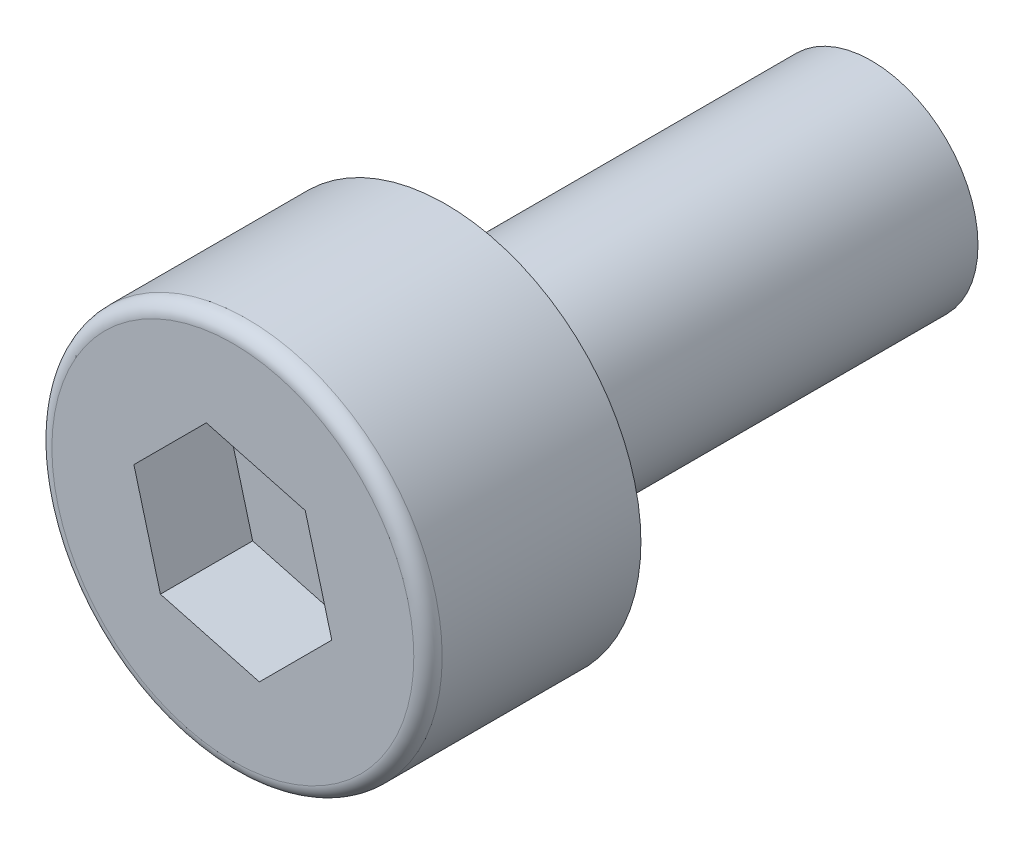
ISO-10303-21;
HEADER;
FILE_DESCRIPTION(('STEP AP214'),'2;1');
FILE_NAME('part.step','',(''),(''),'','','');
FILE_SCHEMA(('AUTOMOTIVE_DESIGN { 1 0 10303 214 1 1 1 1 }'));
ENDSEC;
DATA;
#1=APPLICATION_CONTEXT('core data for automotive mechanical design processes');
#2=APPLICATION_PROTOCOL_DEFINITION('international standard','automotive_design',2000,#1);
#3=PRODUCT_CONTEXT('',#1,'mechanical');
#4=PRODUCT('Part','Part','',(#3));
#5=PRODUCT_RELATED_PRODUCT_CATEGORY('part','',(#4));
#6=PRODUCT_DEFINITION_FORMATION('','',#4);
#7=PRODUCT_DEFINITION_CONTEXT('part definition',#1,'design');
#8=PRODUCT_DEFINITION('design','',#6,#7);
#9=PRODUCT_DEFINITION_SHAPE('','',#8);
#10=(LENGTH_UNIT() NAMED_UNIT(*) SI_UNIT(.MILLI.,.METRE.));
#11=(NAMED_UNIT(*) PLANE_ANGLE_UNIT() SI_UNIT($,.RADIAN.));
#12=(NAMED_UNIT(*) SI_UNIT($,.STERADIAN.) SOLID_ANGLE_UNIT());
#13=UNCERTAINTY_MEASURE_WITH_UNIT(LENGTH_MEASURE(1.E-05),#10,'distance_accuracy_value','');
#14=(GEOMETRIC_REPRESENTATION_CONTEXT(3) GLOBAL_UNCERTAINTY_ASSIGNED_CONTEXT((#13)) GLOBAL_UNIT_ASSIGNED_CONTEXT((#10,
#11,#12)) REPRESENTATION_CONTEXT('',''));
#15=CARTESIAN_POINT('',(0.,0.,0.));
#16=DIRECTION('',(0.,0.,1.));
#17=DIRECTION('',(1.,0.,0.));
#18=AXIS2_PLACEMENT_3D('',#15,#16,#17);
#19=CARTESIAN_POINT('',(0.,0.,0.));
#20=DIRECTION('',(0.,0.,1.));
#21=DIRECTION('',(1.,0.,0.));
#22=AXIS2_PLACEMENT_3D('',#19,#20,#21);
#23=PLANE('',#22);
#24=CARTESIAN_POINT('',(0.,0.,0.));
#25=DIRECTION('',(0.,0.,1.));
#26=DIRECTION('',(1.,0.,0.));
#27=AXIS2_PLACEMENT_3D('',#24,#25,#26);
#28=CIRCLE('',#27,2.75);
#29=CARTESIAN_POINT('',(2.75,0.,0.));
#30=VERTEX_POINT('',#29);
#31=EDGE_CURVE('E137',#30,#30,#28,.T.);
#32=ORIENTED_EDGE('',*,*,#31,.F.);
#33=EDGE_LOOP('',(#32));
#34=FACE_BOUND('',#33,.T.);
#35=CARTESIAN_POINT('',(0.,0.,0.));
#36=DIRECTION('',(0.,0.,1.));
#37=DIRECTION('',(1.,0.,0.));
#38=AXIS2_PLACEMENT_3D('',#35,#36,#37);
#39=CIRCLE('',#38,1.5);
#40=CARTESIAN_POINT('',(1.5,0.,0.));
#41=VERTEX_POINT('',#40);
#42=EDGE_CURVE('E145',#41,#41,#39,.F.);
#43=ORIENTED_EDGE('',*,*,#42,.F.);
#44=EDGE_LOOP('',(#43));
#45=FACE_BOUND('',#44,.T.);
#46=ADVANCED_FACE('F34',(#34,#45),#23,.F.);
#47=CARTESIAN_POINT('',(0.,0.,3.));
#48=DIRECTION('',(0.,0.,-1.));
#49=DIRECTION('',(-1.,0.,0.));
#50=AXIS2_PLACEMENT_3D('',#47,#48,#49);
#51=CYLINDRICAL_SURFACE('',#50,2.75);
#52=CARTESIAN_POINT('',(0.,0.,2.8));
#53=DIRECTION('',(0.,0.,1.));
#54=DIRECTION('',(1.,0.,0.));
#55=AXIS2_PLACEMENT_3D('',#52,#53,#54);
#56=CIRCLE('',#55,2.75);
#57=CARTESIAN_POINT('',(2.75,0.,2.8));
#58=VERTEX_POINT('',#57);
#59=EDGE_CURVE('E11',#58,#58,#56,.F.);
#60=ORIENTED_EDGE('',*,*,#59,.T.);
#61=EDGE_LOOP('',(#60));
#62=FACE_BOUND('',#61,.T.);
#63=ORIENTED_EDGE('',*,*,#31,.T.);
#64=EDGE_LOOP('',(#63));
#65=FACE_BOUND('',#64,.T.);
#66=ADVANCED_FACE('F164',(#62,#65),#51,.T.);
#67=CARTESIAN_POINT('',(0.,0.,3.));
#68=DIRECTION('',(0.,0.,1.));
#69=DIRECTION('',(1.,0.,0.));
#70=AXIS2_PLACEMENT_3D('',#67,#68,#69);
#71=PLANE('',#70);
#72=CARTESIAN_POINT('',(0.,0.,3.));
#73=DIRECTION('',(0.,0.,1.));
#74=DIRECTION('',(1.,0.,0.));
#75=AXIS2_PLACEMENT_3D('',#72,#73,#74);
#76=CIRCLE('',#75,2.55);
#77=CARTESIAN_POINT('',(2.55,0.,3.));
#78=VERTEX_POINT('',#77);
#79=EDGE_CURVE('E42',#78,#78,#76,.T.);
#80=ORIENTED_EDGE('',*,*,#79,.T.);
#81=EDGE_LOOP('',(#80));
#82=FACE_BOUND('',#81,.T.);
#83=DIRECTION('',(0.258819045102521,-0.965925826289068,0.));
#84=VECTOR('',#83,1.);
#85=CARTESIAN_POINT('',(-1.39419383956301,0.373573113403356,3.));
#86=LINE('',#85,#84);
#87=CARTESIAN_POINT('',(-1.39419383956301,0.373573113403356,3.));
#88=VERTEX_POINT('',#87);
#89=CARTESIAN_POINT('',(-1.02062072615966,-1.02062072615966,3.));
#90=VERTEX_POINT('',#89);
#91=EDGE_CURVE('E49',#88,#90,#86,.T.);
#92=ORIENTED_EDGE('',*,*,#91,.F.);
#93=DIRECTION('',(-0.707106781186548,-0.707106781186548,0.));
#94=VECTOR('',#93,1.);
#95=CARTESIAN_POINT('',(-0.373573113403355,1.39419383956301,3.));
#96=LINE('',#95,#94);
#97=CARTESIAN_POINT('',(-0.373573113403355,1.39419383956301,3.));
#98=VERTEX_POINT('',#97);
#99=EDGE_CURVE('E133',#98,#88,#96,.T.);
#100=ORIENTED_EDGE('',*,*,#99,.F.);
#101=DIRECTION('',(-0.965925826289068,0.258819045102521,0.));
#102=VECTOR('',#101,1.);
#103=CARTESIAN_POINT('',(1.02062072615966,1.02062072615966,3.));
#104=LINE('',#103,#102);
#105=CARTESIAN_POINT('',(1.02062072615966,1.02062072615966,3.));
#106=VERTEX_POINT('',#105);
#107=EDGE_CURVE('E131',#106,#98,#104,.T.);
#108=ORIENTED_EDGE('',*,*,#107,.F.);
#109=DIRECTION('',(-0.258819045102521,0.965925826289068,0.));
#110=VECTOR('',#109,1.);
#111=CARTESIAN_POINT('',(1.39419383956301,-0.373573113403355,3.));
#112=LINE('',#111,#110);
#113=CARTESIAN_POINT('',(1.39419383956301,-0.373573113403355,3.));
#114=VERTEX_POINT('',#113);
#115=EDGE_CURVE('E97',#114,#106,#112,.T.);
#116=ORIENTED_EDGE('',*,*,#115,.F.);
#117=DIRECTION('',(0.707106781186548,0.707106781186548,0.));
#118=VECTOR('',#117,1.);
#119=CARTESIAN_POINT('',(0.373573113403355,-1.39419383956301,3.));
#120=LINE('',#119,#118);
#121=CARTESIAN_POINT('',(0.373573113403355,-1.39419383956301,3.));
#122=VERTEX_POINT('',#121);
#123=EDGE_CURVE('E127',#122,#114,#120,.T.);
#124=ORIENTED_EDGE('',*,*,#123,.F.);
#125=DIRECTION('',(0.965925826289068,-0.258819045102521,0.));
#126=VECTOR('',#125,1.);
#127=CARTESIAN_POINT('',(-1.02062072615966,-1.02062072615966,3.));
#128=LINE('',#127,#126);
#129=EDGE_CURVE('E123',#90,#122,#128,.T.);
#130=ORIENTED_EDGE('',*,*,#129,.F.);
#131=EDGE_LOOP('',(#92,#100,#108,#116,#124,#130));
#132=FACE_BOUND('',#131,.T.);
#133=ADVANCED_FACE('F150',(#82,#132),#71,.T.);
#134=CARTESIAN_POINT('',(-1.39419383956301,0.373573113403356,1.7));
#135=DIRECTION('',(-0.965925826289068,-0.258819045102521,0.));
#136=DIRECTION('',(0.258819045102521,-0.965925826289068,0.));
#137=AXIS2_PLACEMENT_3D('',#134,#135,#136);
#138=PLANE('',#137);
#139=ORIENTED_EDGE('',*,*,#91,.T.);
#140=DIRECTION('',(0.,0.,1.));
#141=VECTOR('',#140,1.);
#142=CARTESIAN_POINT('',(-1.02062072615966,-1.02062072615966,1.7));
#143=LINE('',#142,#141);
#144=CARTESIAN_POINT('',(-1.02062072615966,-1.02062072615966,1.7));
#145=VERTEX_POINT('',#144);
#146=EDGE_CURVE('E79',#145,#90,#143,.T.);
#147=ORIENTED_EDGE('',*,*,#146,.F.);
#148=DIRECTION('',(0.258819045102521,-0.965925826289068,0.));
#149=VECTOR('',#148,1.);
#150=CARTESIAN_POINT('',(-1.39419383956301,0.373573113403356,1.7));
#151=LINE('',#150,#149);
#152=CARTESIAN_POINT('',(-1.39419383956301,0.373573113403356,1.7));
#153=VERTEX_POINT('',#152);
#154=EDGE_CURVE('E135',#153,#145,#151,.T.);
#155=ORIENTED_EDGE('',*,*,#154,.F.);
#156=DIRECTION('',(0.,0.,1.));
#157=VECTOR('',#156,1.);
#158=CARTESIAN_POINT('',(-1.39419383956301,0.373573113403356,1.7));
#159=LINE('',#158,#157);
#160=EDGE_CURVE('E57',#153,#88,#159,.T.);
#161=ORIENTED_EDGE('',*,*,#160,.T.);
#162=EDGE_LOOP('',(#139,#147,#155,#161));
#163=FACE_BOUND('',#162,.T.);
#164=ADVANCED_FACE('F176',(#163),#138,.F.);
#165=CARTESIAN_POINT('',(-0.373573113403355,1.39419383956301,1.7));
#166=DIRECTION('',(-0.707106781186548,0.707106781186548,0.));
#167=DIRECTION('',(-0.707106781186548,-0.707106781186548,0.));
#168=AXIS2_PLACEMENT_3D('',#165,#166,#167);
#169=PLANE('',#168);
#170=ORIENTED_EDGE('',*,*,#99,.T.);
#171=ORIENTED_EDGE('',*,*,#160,.F.);
#172=DIRECTION('',(-0.707106781186548,-0.707106781186548,0.));
#173=VECTOR('',#172,1.);
#174=CARTESIAN_POINT('',(-0.373573113403355,1.39419383956301,1.7));
#175=LINE('',#174,#173);
#176=CARTESIAN_POINT('',(-0.373573113403355,1.39419383956301,1.7));
#177=VERTEX_POINT('',#176);
#178=EDGE_CURVE('E109',#177,#153,#175,.T.);
#179=ORIENTED_EDGE('',*,*,#178,.F.);
#180=DIRECTION('',(0.,0.,1.));
#181=VECTOR('',#180,1.);
#182=CARTESIAN_POINT('',(-0.373573113403355,1.39419383956301,1.7));
#183=LINE('',#182,#181);
#184=EDGE_CURVE('E101',#177,#98,#183,.T.);
#185=ORIENTED_EDGE('',*,*,#184,.T.);
#186=EDGE_LOOP('',(#170,#171,#179,#185));
#187=FACE_BOUND('',#186,.T.);
#188=ADVANCED_FACE('F179',(#187),#169,.F.);
#189=CARTESIAN_POINT('',(1.02062072615966,1.02062072615966,1.7));
#190=DIRECTION('',(0.258819045102521,0.965925826289068,0.));
#191=DIRECTION('',(-0.965925826289068,0.258819045102521,0.));
#192=AXIS2_PLACEMENT_3D('',#189,#190,#191);
#193=PLANE('',#192);
#194=ORIENTED_EDGE('',*,*,#107,.T.);
#195=ORIENTED_EDGE('',*,*,#184,.F.);
#196=DIRECTION('',(-0.965925826289068,0.258819045102521,0.));
#197=VECTOR('',#196,1.);
#198=CARTESIAN_POINT('',(1.02062072615966,1.02062072615966,1.7));
#199=LINE('',#198,#197);
#200=CARTESIAN_POINT('',(1.02062072615966,1.02062072615966,1.7));
#201=VERTEX_POINT('',#200);
#202=EDGE_CURVE('E105',#201,#177,#199,.T.);
#203=ORIENTED_EDGE('',*,*,#202,.F.);
#204=DIRECTION('',(0.,0.,1.));
#205=VECTOR('',#204,1.);
#206=CARTESIAN_POINT('',(1.02062072615966,1.02062072615966,1.7));
#207=LINE('',#206,#205);
#208=EDGE_CURVE('E90',#201,#106,#207,.T.);
#209=ORIENTED_EDGE('',*,*,#208,.T.);
#210=EDGE_LOOP('',(#194,#195,#203,#209));
#211=FACE_BOUND('',#210,.T.);
#212=ADVANCED_FACE('F106',(#211),#193,.F.);
#213=CARTESIAN_POINT('',(1.39419383956301,-0.373573113403355,1.7));
#214=DIRECTION('',(0.965925826289068,0.258819045102521,0.));
#215=DIRECTION('',(-0.258819045102521,0.965925826289068,0.));
#216=AXIS2_PLACEMENT_3D('',#213,#214,#215);
#217=PLANE('',#216);
#218=ORIENTED_EDGE('',*,*,#115,.T.);
#219=ORIENTED_EDGE('',*,*,#208,.F.);
#220=DIRECTION('',(-0.258819045102521,0.965925826289068,0.));
#221=VECTOR('',#220,1.);
#222=CARTESIAN_POINT('',(1.39419383956301,-0.373573113403355,1.7));
#223=LINE('',#222,#221);
#224=CARTESIAN_POINT('',(1.39419383956301,-0.373573113403355,1.7));
#225=VERTEX_POINT('',#224);
#226=EDGE_CURVE('E94',#225,#201,#223,.T.);
#227=ORIENTED_EDGE('',*,*,#226,.F.);
#228=DIRECTION('',(0.,0.,1.));
#229=VECTOR('',#228,1.);
#230=CARTESIAN_POINT('',(1.39419383956301,-0.373573113403355,1.7));
#231=LINE('',#230,#229);
#232=EDGE_CURVE('E102',#225,#114,#231,.T.);
#233=ORIENTED_EDGE('',*,*,#232,.T.);
#234=EDGE_LOOP('',(#218,#219,#227,#233));
#235=FACE_BOUND('',#234,.T.);
#236=ADVANCED_FACE('F92',(#235),#217,.F.);
#237=CARTESIAN_POINT('',(0.373573113403355,-1.39419383956301,1.7));
#238=DIRECTION('',(0.707106781186548,-0.707106781186548,0.));
#239=DIRECTION('',(0.707106781186548,0.707106781186548,0.));
#240=AXIS2_PLACEMENT_3D('',#237,#238,#239);
#241=PLANE('',#240);
#242=ORIENTED_EDGE('',*,*,#123,.T.);
#243=ORIENTED_EDGE('',*,*,#232,.F.);
#244=DIRECTION('',(0.707106781186548,0.707106781186548,0.));
#245=VECTOR('',#244,1.);
#246=CARTESIAN_POINT('',(0.373573113403355,-1.39419383956301,1.7));
#247=LINE('',#246,#245);
#248=CARTESIAN_POINT('',(0.373573113403355,-1.39419383956301,1.7));
#249=VERTEX_POINT('',#248);
#250=EDGE_CURVE('E115',#249,#225,#247,.T.);
#251=ORIENTED_EDGE('',*,*,#250,.F.);
#252=DIRECTION('',(0.,0.,1.));
#253=VECTOR('',#252,1.);
#254=CARTESIAN_POINT('',(0.373573113403355,-1.39419383956301,1.7));
#255=LINE('',#254,#253);
#256=EDGE_CURVE('E140',#249,#122,#255,.T.);
#257=ORIENTED_EDGE('',*,*,#256,.T.);
#258=EDGE_LOOP('',(#242,#243,#251,#257));
#259=FACE_BOUND('',#258,.T.);
#260=ADVANCED_FACE('F183',(#259),#241,.F.);
#261=CARTESIAN_POINT('',(-1.02062072615966,-1.02062072615966,1.7));
#262=DIRECTION('',(-0.258819045102521,-0.965925826289068,0.));
#263=DIRECTION('',(0.965925826289068,-0.258819045102521,0.));
#264=AXIS2_PLACEMENT_3D('',#261,#262,#263);
#265=PLANE('',#264);
#266=ORIENTED_EDGE('',*,*,#129,.T.);
#267=ORIENTED_EDGE('',*,*,#256,.F.);
#268=DIRECTION('',(0.965925826289068,-0.258819045102521,0.));
#269=VECTOR('',#268,1.);
#270=CARTESIAN_POINT('',(-1.02062072615966,-1.02062072615966,1.7));
#271=LINE('',#270,#269);
#272=EDGE_CURVE('E117',#145,#249,#271,.T.);
#273=ORIENTED_EDGE('',*,*,#272,.F.);
#274=ORIENTED_EDGE('',*,*,#146,.T.);
#275=EDGE_LOOP('',(#266,#267,#273,#274));
#276=FACE_BOUND('',#275,.T.);
#277=ADVANCED_FACE('F180',(#276),#265,.F.);
#278=CARTESIAN_POINT('',(0.,0.,1.7));
#279=DIRECTION('',(0.,0.,1.));
#280=DIRECTION('',(1.,0.,0.));
#281=AXIS2_PLACEMENT_3D('',#278,#279,#280);
#282=PLANE('',#281);
#283=ORIENTED_EDGE('',*,*,#154,.T.);
#284=ORIENTED_EDGE('',*,*,#272,.T.);
#285=ORIENTED_EDGE('',*,*,#250,.T.);
#286=ORIENTED_EDGE('',*,*,#226,.T.);
#287=ORIENTED_EDGE('',*,*,#202,.T.);
#288=ORIENTED_EDGE('',*,*,#178,.T.);
#289=EDGE_LOOP('',(#283,#284,#285,#286,#287,#288));
#290=FACE_BOUND('',#289,.T.);
#291=ADVANCED_FACE('F112',(#290),#282,.T.);
#292=CARTESIAN_POINT('',(0.,0.,-6.));
#293=DIRECTION('',(0.,0.,1.));
#294=DIRECTION('',(1.,0.,0.));
#295=AXIS2_PLACEMENT_3D('',#292,#293,#294);
#296=CYLINDRICAL_SURFACE('',#295,1.5);
#297=CARTESIAN_POINT('',(0.,0.,-6.));
#298=DIRECTION('',(0.,0.,-1.));
#299=DIRECTION('',(-1.,0.,0.));
#300=AXIS2_PLACEMENT_3D('',#297,#298,#299);
#301=CIRCLE('',#300,1.5);
#302=CARTESIAN_POINT('',(-1.5,0.,-6.));
#303=VERTEX_POINT('',#302);
#304=EDGE_CURVE('E124',#303,#303,#301,.T.);
#305=ORIENTED_EDGE('',*,*,#304,.F.);
#306=EDGE_LOOP('',(#305));
#307=FACE_BOUND('',#306,.T.);
#308=ORIENTED_EDGE('',*,*,#42,.T.);
#309=EDGE_LOOP('',(#308));
#310=FACE_BOUND('',#309,.T.);
#311=ADVANCED_FACE('F159',(#307,#310),#296,.T.);
#312=CARTESIAN_POINT('',(0.,0.,-6.));
#313=DIRECTION('',(0.,0.,-1.));
#314=DIRECTION('',(-1.,0.,0.));
#315=AXIS2_PLACEMENT_3D('',#312,#313,#314);
#316=PLANE('',#315);
#317=ORIENTED_EDGE('',*,*,#304,.T.);
#318=EDGE_LOOP('',(#317));
#319=FACE_BOUND('',#318,.T.);
#320=ADVANCED_FACE('F154',(#319),#316,.T.);
#321=CARTESIAN_POINT('',(0.,0.,2.8));
#322=DIRECTION('',(0.,0.,1.));
#323=DIRECTION('',(1.,0.,0.));
#324=AXIS2_PLACEMENT_3D('',#321,#322,#323);
#325=TOROIDAL_SURFACE('',#324,2.55,0.2);
#326=ORIENTED_EDGE('',*,*,#59,.F.);
#327=EDGE_LOOP('',(#326));
#328=FACE_BOUND('',#327,.T.);
#329=ORIENTED_EDGE('',*,*,#79,.F.);
#330=EDGE_LOOP('',(#329));
#331=FACE_BOUND('',#330,.T.);
#332=ADVANCED_FACE('F36',(#328,#331),#325,.T.);
#333=CLOSED_SHELL('',(#46,#66,#133,#164,#188,#212,#236,#260,#277,#291,#311,#320,#332));
#334=MANIFOLD_SOLID_BREP('B2',#333);
#335=ADVANCED_BREP_SHAPE_REPRESENTATION('',(#18,#334),#14);
#336=SHAPE_DEFINITION_REPRESENTATION(#9,#335);
ENDSEC;
END-ISO-10303-21;
